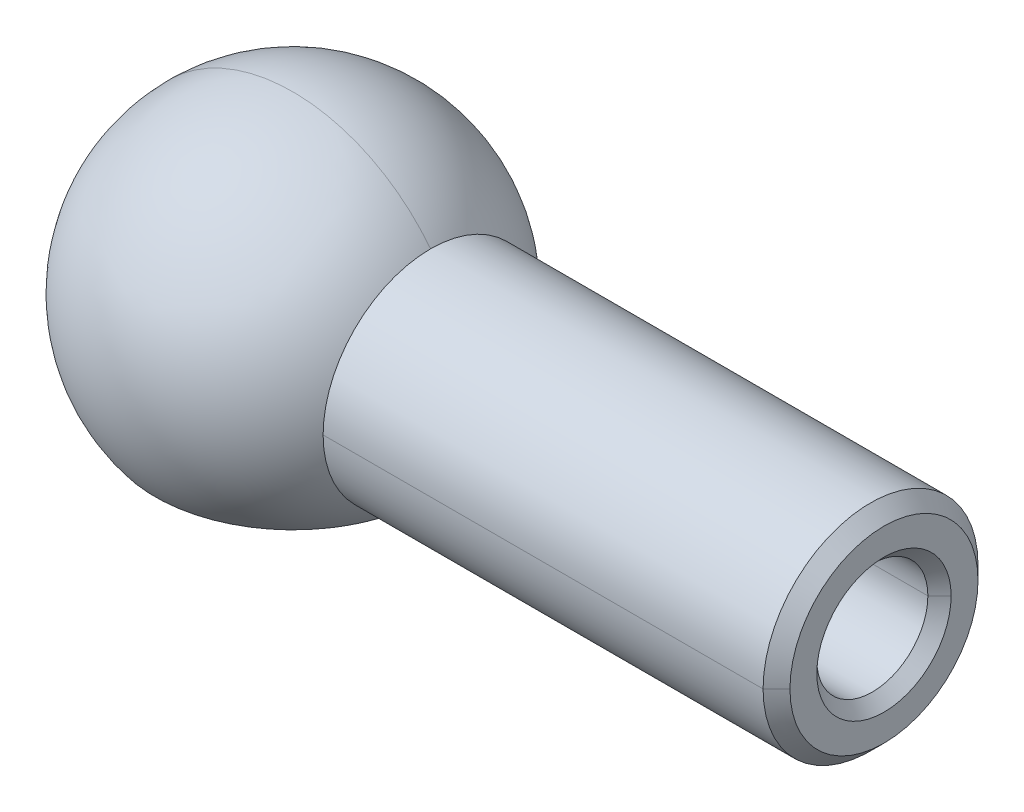
ISO-10303-21;
HEADER;
FILE_DESCRIPTION(('STEP AP214'),'2;1');
FILE_NAME('part.step','',(''),(''),'','','');
FILE_SCHEMA(('AUTOMOTIVE_DESIGN { 1 0 10303 214 1 1 1 1 }'));
ENDSEC;
DATA;
#1=APPLICATION_CONTEXT('core data for automotive mechanical design processes');
#2=APPLICATION_PROTOCOL_DEFINITION('international standard','automotive_design',2000,#1);
#3=PRODUCT_CONTEXT('',#1,'mechanical');
#4=PRODUCT('Part','Part','',(#3));
#5=PRODUCT_RELATED_PRODUCT_CATEGORY('part','',(#4));
#6=PRODUCT_DEFINITION_FORMATION('','',#4);
#7=PRODUCT_DEFINITION_CONTEXT('part definition',#1,'design');
#8=PRODUCT_DEFINITION('design','',#6,#7);
#9=PRODUCT_DEFINITION_SHAPE('','',#8);
#10=(LENGTH_UNIT() NAMED_UNIT(*) SI_UNIT(.MILLI.,.METRE.));
#11=(NAMED_UNIT(*) PLANE_ANGLE_UNIT() SI_UNIT($,.RADIAN.));
#12=(NAMED_UNIT(*) SI_UNIT($,.STERADIAN.) SOLID_ANGLE_UNIT());
#13=UNCERTAINTY_MEASURE_WITH_UNIT(LENGTH_MEASURE(1.E-05),#10,'distance_accuracy_value','');
#14=(GEOMETRIC_REPRESENTATION_CONTEXT(3) GLOBAL_UNCERTAINTY_ASSIGNED_CONTEXT((#13)) GLOBAL_UNIT_ASSIGNED_CONTEXT((#10,
#11,#12)) REPRESENTATION_CONTEXT('',''));
#15=CARTESIAN_POINT('',(0.,0.,0.));
#16=DIRECTION('',(0.,0.,1.));
#17=DIRECTION('',(1.,0.,0.));
#18=AXIS2_PLACEMENT_3D('',#15,#16,#17);
#19=CARTESIAN_POINT('',(-22.,0.,0.));
#20=DIRECTION('',(1.,0.,0.));
#21=DIRECTION('',(0.,0.,1.));
#22=AXIS2_PLACEMENT_3D('',#19,#20,#21);
#23=SPHERICAL_SURFACE('',#22,6.50000000000011);
#24=CARTESIAN_POINT('',(-22.,0.,0.));
#25=DIRECTION('',(0.,0.,1.));
#26=DIRECTION('',(0.788226981996904,0.615384615384601,0.));
#27=AXIS2_PLACEMENT_3D('',#24,#25,#26);
#28=CIRCLE('',#27,6.50000000000011);
#29=CARTESIAN_POINT('',(-16.87652461702,3.9999999999999,0.));
#30=VERTEX_POINT('',#29);
#31=CARTESIAN_POINT('',(-28.5000000000001,0.,0.));
#32=VERTEX_POINT('',#31);
#33=EDGE_CURVE('E11',#30,#32,#28,.T.);
#34=ORIENTED_EDGE('',*,*,#33,.F.);
#35=CARTESIAN_POINT('',(-16.87652461702,0.,0.));
#36=DIRECTION('',(1.,0.,0.));
#37=DIRECTION('',(0.,0.,-1.));
#38=AXIS2_PLACEMENT_3D('',#35,#36,#37);
#39=CIRCLE('',#38,4.);
#40=CARTESIAN_POINT('',(-16.87652461702,0.,-4.));
#41=VERTEX_POINT('',#40);
#42=EDGE_CURVE('E25',#41,#30,#39,.T.);
#43=ORIENTED_EDGE('',*,*,#42,.F.);
#44=CARTESIAN_POINT('',(-16.87652461702,0.,0.));
#45=DIRECTION('',(1.,0.,0.));
#46=DIRECTION('',(0.,0.,-1.));
#47=AXIS2_PLACEMENT_3D('',#44,#45,#46);
#48=CIRCLE('',#47,4.);
#49=CARTESIAN_POINT('',(-16.87652461702,-4.00000000000004,0.));
#50=VERTEX_POINT('',#49);
#51=EDGE_CURVE('E223',#50,#41,#48,.T.);
#52=ORIENTED_EDGE('',*,*,#51,.F.);
#53=CARTESIAN_POINT('',(-22.,0.,0.));
#54=DIRECTION('',(0.,0.,-1.));
#55=DIRECTION('',(0.788226981996904,-0.615384615384601,0.));
#56=AXIS2_PLACEMENT_3D('',#53,#54,#55);
#57=CIRCLE('',#56,6.50000000000011);
#58=CARTESIAN_POINT('',(-16.9000000000001,-4.02988833592232,0.));
#59=VERTEX_POINT('',#58);
#60=EDGE_CURVE('E219',#50,#59,#57,.T.);
#61=ORIENTED_EDGE('',*,*,#60,.T.);
#62=CARTESIAN_POINT('',(-16.9,0.,0.));
#63=DIRECTION('',(-1.,0.,0.));
#64=DIRECTION('',(0.,0.,-1.));
#65=AXIS2_PLACEMENT_3D('',#62,#63,#64);
#66=CIRCLE('',#65,4.0298883359223);
#67=CARTESIAN_POINT('',(-16.9,-4.,-0.489897948559877));
#68=VERTEX_POINT('',#67);
#69=EDGE_CURVE('E214',#68,#59,#66,.T.);
#70=ORIENTED_EDGE('',*,*,#69,.F.);
#71=CARTESIAN_POINT('',(-22.,-4.,0.));
#72=DIRECTION('',(0.,1.,0.));
#73=DIRECTION('',(0.,0.,-1.));
#74=AXIS2_PLACEMENT_3D('',#71,#72,#73);
#75=CIRCLE('',#74,5.12347538298);
#76=CARTESIAN_POINT('',(-27.12347538298,-4.,0.));
#77=VERTEX_POINT('',#76);
#78=EDGE_CURVE('E210',#68,#77,#75,.T.);
#79=ORIENTED_EDGE('',*,*,#78,.T.);
#80=CARTESIAN_POINT('',(-22.,0.,0.));
#81=DIRECTION('',(0.,0.,-1.));
#82=DIRECTION('',(-0.788226981996909,-0.615384615384594,0.));
#83=AXIS2_PLACEMENT_3D('',#80,#81,#82);
#84=CIRCLE('',#83,6.50000000000011);
#85=EDGE_CURVE('E206',#77,#32,#84,.T.);
#86=ORIENTED_EDGE('',*,*,#85,.T.);
#87=EDGE_LOOP('',(#34,#43,#52,#61,#70,#79,#86));
#88=FACE_BOUND('',#87,.T.);
#89=ADVANCED_FACE('F17',(#88),#23,.T.);
#90=CARTESIAN_POINT('',(-22.,0.,0.));
#91=DIRECTION('',(1.,0.,0.));
#92=DIRECTION('',(0.,0.,-1.));
#93=AXIS2_PLACEMENT_3D('',#90,#91,#92);
#94=SPHERICAL_SURFACE('',#93,6.50000000000011);
#95=ORIENTED_EDGE('',*,*,#85,.F.);
#96=CARTESIAN_POINT('',(-22.,-4.,0.));
#97=DIRECTION('',(0.,1.,0.));
#98=DIRECTION('',(0.,0.,-1.));
#99=AXIS2_PLACEMENT_3D('',#96,#97,#98);
#100=CIRCLE('',#99,5.12347538298);
#101=CARTESIAN_POINT('',(-16.9,-4.,0.489897948559877));
#102=VERTEX_POINT('',#101);
#103=EDGE_CURVE('E202',#77,#102,#100,.T.);
#104=ORIENTED_EDGE('',*,*,#103,.T.);
#105=CARTESIAN_POINT('',(-16.9,0.,0.));
#106=DIRECTION('',(-1.,0.,0.));
#107=DIRECTION('',(0.,0.,-1.));
#108=AXIS2_PLACEMENT_3D('',#105,#106,#107);
#109=CIRCLE('',#108,4.0298883359223);
#110=EDGE_CURVE('E197',#59,#102,#109,.T.);
#111=ORIENTED_EDGE('',*,*,#110,.F.);
#112=ORIENTED_EDGE('',*,*,#60,.F.);
#113=CARTESIAN_POINT('',(-16.87652461702,0.,0.));
#114=DIRECTION('',(1.,0.,0.));
#115=DIRECTION('',(0.,0.,-1.));
#116=AXIS2_PLACEMENT_3D('',#113,#114,#115);
#117=CIRCLE('',#116,4.);
#118=CARTESIAN_POINT('',(-16.87652461702,0.,4.));
#119=VERTEX_POINT('',#118);
#120=EDGE_CURVE('E192',#119,#50,#117,.T.);
#121=ORIENTED_EDGE('',*,*,#120,.F.);
#122=CARTESIAN_POINT('',(-16.87652461702,0.,0.));
#123=DIRECTION('',(1.,0.,0.));
#124=DIRECTION('',(0.,0.,-1.));
#125=AXIS2_PLACEMENT_3D('',#122,#123,#124);
#126=CIRCLE('',#125,4.);
#127=EDGE_CURVE('E187',#30,#119,#126,.T.);
#128=ORIENTED_EDGE('',*,*,#127,.F.);
#129=ORIENTED_EDGE('',*,*,#33,.T.);
#130=EDGE_LOOP('',(#95,#104,#111,#112,#121,#128,#129));
#131=FACE_BOUND('',#130,.T.);
#132=ADVANCED_FACE('F237',(#131),#94,.T.);
#133=CARTESIAN_POINT('',(0.,0.,0.));
#134=DIRECTION('',(1.,0.,0.));
#135=DIRECTION('',(0.,-1.,0.));
#136=AXIS2_PLACEMENT_3D('',#133,#134,#135);
#137=CYLINDRICAL_SURFACE('',#136,4.);
#138=DIRECTION('',(1.,0.,0.));
#139=VECTOR('',#138,1.);
#140=CARTESIAN_POINT('',(-16.87652461702,0.,4.));
#141=LINE('',#140,#139);
#142=CARTESIAN_POINT('',(-0.5,0.,4.));
#143=VERTEX_POINT('',#142);
#144=EDGE_CURVE('E183',#119,#143,#141,.T.);
#145=ORIENTED_EDGE('',*,*,#144,.T.);
#146=CARTESIAN_POINT('',(-0.5,0.,0.));
#147=DIRECTION('',(1.,0.,0.));
#148=DIRECTION('',(0.,0.,-1.));
#149=AXIS2_PLACEMENT_3D('',#146,#147,#148);
#150=CIRCLE('',#149,4.);
#151=CARTESIAN_POINT('',(-0.5,0.,-4.));
#152=VERTEX_POINT('',#151);
#153=EDGE_CURVE('E178',#152,#143,#150,.T.);
#154=ORIENTED_EDGE('',*,*,#153,.F.);
#155=DIRECTION('',(1.,0.,0.));
#156=VECTOR('',#155,1.);
#157=CARTESIAN_POINT('',(-16.87652461702,0.,-4.));
#158=LINE('',#157,#156);
#159=EDGE_CURVE('E173',#41,#152,#158,.T.);
#160=ORIENTED_EDGE('',*,*,#159,.F.);
#161=ORIENTED_EDGE('',*,*,#42,.T.);
#162=ORIENTED_EDGE('',*,*,#127,.T.);
#163=EDGE_LOOP('',(#145,#154,#160,#161,#162));
#164=FACE_BOUND('',#163,.T.);
#165=ADVANCED_FACE('F234',(#164),#137,.T.);
#166=CARTESIAN_POINT('',(0.,0.,0.));
#167=DIRECTION('',(1.,0.,0.));
#168=DIRECTION('',(0.,1.,-5.8935951136395E-10));
#169=AXIS2_PLACEMENT_3D('',#166,#167,#168);
#170=CYLINDRICAL_SURFACE('',#169,4.);
#171=ORIENTED_EDGE('',*,*,#144,.F.);
#172=ORIENTED_EDGE('',*,*,#120,.T.);
#173=ORIENTED_EDGE('',*,*,#51,.T.);
#174=ORIENTED_EDGE('',*,*,#159,.T.);
#175=CARTESIAN_POINT('',(-0.5,0.,0.));
#176=DIRECTION('',(1.,0.,0.));
#177=DIRECTION('',(0.,0.,-1.));
#178=AXIS2_PLACEMENT_3D('',#175,#176,#177);
#179=CIRCLE('',#178,4.);
#180=EDGE_CURVE('E168',#143,#152,#179,.T.);
#181=ORIENTED_EDGE('',*,*,#180,.F.);
#182=EDGE_LOOP('',(#171,#172,#173,#174,#181));
#183=FACE_BOUND('',#182,.T.);
#184=ADVANCED_FACE('F243',(#183),#170,.T.);
#185=CARTESIAN_POINT('',(-0.5,0.,0.));
#186=DIRECTION('',(-1.,0.,0.));
#187=DIRECTION('',(0.,1.,0.));
#188=AXIS2_PLACEMENT_3D('',#185,#186,#187);
#189=CONICAL_SURFACE('',#188,4.,0.785398163397448);
#190=DIRECTION('',(-0.707106781186548,0.,-0.707106781186547));
#191=VECTOR('',#190,1.);
#192=CARTESIAN_POINT('',(0.,0.,-3.5));
#193=LINE('',#192,#191);
#194=CARTESIAN_POINT('',(0.,0.,-3.5));
#195=VERTEX_POINT('',#194);
#196=EDGE_CURVE('E163',#195,#152,#193,.T.);
#197=ORIENTED_EDGE('',*,*,#196,.F.);
#198=CARTESIAN_POINT('',(0.,0.,0.));
#199=DIRECTION('',(1.,0.,0.));
#200=DIRECTION('',(0.,0.,-1.));
#201=AXIS2_PLACEMENT_3D('',#198,#199,#200);
#202=CIRCLE('',#201,3.5);
#203=CARTESIAN_POINT('',(0.,0.,3.5));
#204=VERTEX_POINT('',#203);
#205=EDGE_CURVE('E158',#204,#195,#202,.T.);
#206=ORIENTED_EDGE('',*,*,#205,.F.);
#207=DIRECTION('',(-0.707106781186548,0.,0.707106781186547));
#208=VECTOR('',#207,1.);
#209=CARTESIAN_POINT('',(0.,0.,3.5));
#210=LINE('',#209,#208);
#211=EDGE_CURVE('E153',#204,#143,#210,.T.);
#212=ORIENTED_EDGE('',*,*,#211,.T.);
#213=ORIENTED_EDGE('',*,*,#180,.T.);
#214=EDGE_LOOP('',(#197,#206,#212,#213));
#215=FACE_BOUND('',#214,.T.);
#216=ADVANCED_FACE('F247',(#215),#189,.T.);
#217=CARTESIAN_POINT('',(-0.5,0.,0.));
#218=DIRECTION('',(-1.,0.,0.));
#219=DIRECTION('',(0.,-1.,0.));
#220=AXIS2_PLACEMENT_3D('',#217,#218,#219);
#221=CONICAL_SURFACE('',#220,4.,0.785398163397448);
#222=ORIENTED_EDGE('',*,*,#196,.T.);
#223=ORIENTED_EDGE('',*,*,#153,.T.);
#224=ORIENTED_EDGE('',*,*,#211,.F.);
#225=CARTESIAN_POINT('',(0.,0.,0.));
#226=DIRECTION('',(1.,0.,0.));
#227=DIRECTION('',(0.,0.,-1.));
#228=AXIS2_PLACEMENT_3D('',#225,#226,#227);
#229=CIRCLE('',#228,3.5);
#230=EDGE_CURVE('E148',#195,#204,#229,.T.);
#231=ORIENTED_EDGE('',*,*,#230,.F.);
#232=EDGE_LOOP('',(#222,#223,#224,#231));
#233=FACE_BOUND('',#232,.T.);
#234=ADVANCED_FACE('F249',(#233),#221,.T.);
#235=CARTESIAN_POINT('',(0.,3.5,0.));
#236=DIRECTION('',(-1.,0.,0.));
#237=DIRECTION('',(0.,0.,1.));
#238=AXIS2_PLACEMENT_3D('',#235,#236,#237);
#239=PLANE('',#238);
#240=CARTESIAN_POINT('',(0.,0.,0.));
#241=DIRECTION('',(1.,0.,0.));
#242=DIRECTION('',(0.,0.,-1.));
#243=AXIS2_PLACEMENT_3D('',#240,#241,#242);
#244=CIRCLE('',#243,2.5);
#245=CARTESIAN_POINT('',(0.,0.,2.5));
#246=VERTEX_POINT('',#245);
#247=CARTESIAN_POINT('',(0.,0.,-2.5));
#248=VERTEX_POINT('',#247);
#249=EDGE_CURVE('E143',#246,#248,#244,.T.);
#250=ORIENTED_EDGE('',*,*,#249,.F.);
#251=CARTESIAN_POINT('',(0.,0.,0.));
#252=DIRECTION('',(1.,0.,0.));
#253=DIRECTION('',(0.,0.,-1.));
#254=AXIS2_PLACEMENT_3D('',#251,#252,#253);
#255=CIRCLE('',#254,2.5);
#256=EDGE_CURVE('E138',#248,#246,#255,.T.);
#257=ORIENTED_EDGE('',*,*,#256,.F.);
#258=EDGE_LOOP('',(#250,#257));
#259=FACE_BOUND('',#258,.T.);
#260=ORIENTED_EDGE('',*,*,#230,.T.);
#261=ORIENTED_EDGE('',*,*,#205,.T.);
#262=EDGE_LOOP('',(#260,#261));
#263=FACE_BOUND('',#262,.T.);
#264=ADVANCED_FACE('F251',(#259,#263),#239,.F.);
#265=CARTESIAN_POINT('',(-0.433,0.,0.));
#266=DIRECTION('',(1.,0.,0.));
#267=DIRECTION('',(0.,-1.,0.));
#268=AXIS2_PLACEMENT_3D('',#265,#266,#267);
#269=CONICAL_SURFACE('',#268,2.067,0.785398163397449);
#270=DIRECTION('',(0.707106781186547,0.,0.707106781186548));
#271=VECTOR('',#270,1.);
#272=CARTESIAN_POINT('',(-0.433,0.,2.067));
#273=LINE('',#272,#271);
#274=CARTESIAN_POINT('',(-0.433,0.,2.067));
#275=VERTEX_POINT('',#274);
#276=EDGE_CURVE('E133',#275,#246,#273,.T.);
#277=ORIENTED_EDGE('',*,*,#276,.F.);
#278=CARTESIAN_POINT('',(-0.433,0.,0.));
#279=DIRECTION('',(1.,0.,0.));
#280=DIRECTION('',(0.,0.,-1.));
#281=AXIS2_PLACEMENT_3D('',#278,#279,#280);
#282=CIRCLE('',#281,2.067);
#283=CARTESIAN_POINT('',(-0.433,0.,-2.067));
#284=VERTEX_POINT('',#283);
#285=EDGE_CURVE('E128',#284,#275,#282,.T.);
#286=ORIENTED_EDGE('',*,*,#285,.F.);
#287=DIRECTION('',(0.707106781186547,0.,-0.707106781186548));
#288=VECTOR('',#287,1.);
#289=CARTESIAN_POINT('',(-0.433,0.,-2.067));
#290=LINE('',#289,#288);
#291=EDGE_CURVE('E123',#284,#248,#290,.T.);
#292=ORIENTED_EDGE('',*,*,#291,.T.);
#293=ORIENTED_EDGE('',*,*,#256,.T.);
#294=EDGE_LOOP('',(#277,#286,#292,#293));
#295=FACE_BOUND('',#294,.T.);
#296=ADVANCED_FACE('F253',(#295),#269,.F.);
#297=CARTESIAN_POINT('',(-0.433,0.,0.));
#298=DIRECTION('',(1.,0.,0.));
#299=DIRECTION('',(0.,1.,0.));
#300=AXIS2_PLACEMENT_3D('',#297,#298,#299);
#301=CONICAL_SURFACE('',#300,2.067,0.785398163397449);
#302=ORIENTED_EDGE('',*,*,#276,.T.);
#303=ORIENTED_EDGE('',*,*,#249,.T.);
#304=ORIENTED_EDGE('',*,*,#291,.F.);
#305=CARTESIAN_POINT('',(-0.433,0.,0.));
#306=DIRECTION('',(1.,0.,0.));
#307=DIRECTION('',(0.,0.,-1.));
#308=AXIS2_PLACEMENT_3D('',#305,#306,#307);
#309=CIRCLE('',#308,2.067);
#310=EDGE_CURVE('E118',#275,#284,#309,.T.);
#311=ORIENTED_EDGE('',*,*,#310,.F.);
#312=EDGE_LOOP('',(#302,#303,#304,#311));
#313=FACE_BOUND('',#312,.T.);
#314=ADVANCED_FACE('F261',(#313),#301,.F.);
#315=CARTESIAN_POINT('',(0.,0.,0.));
#316=DIRECTION('',(1.,0.,0.));
#317=DIRECTION('',(0.,1.,0.));
#318=AXIS2_PLACEMENT_3D('',#315,#316,#317);
#319=CYLINDRICAL_SURFACE('',#318,2.067);
#320=DIRECTION('',(1.,0.,0.));
#321=VECTOR('',#320,1.);
#322=CARTESIAN_POINT('',(-13.933,0.,2.067));
#323=LINE('',#322,#321);
#324=CARTESIAN_POINT('',(-13.933,0.,2.067));
#325=VERTEX_POINT('',#324);
#326=EDGE_CURVE('E113',#325,#275,#323,.T.);
#327=ORIENTED_EDGE('',*,*,#326,.T.);
#328=ORIENTED_EDGE('',*,*,#310,.T.);
#329=DIRECTION('',(1.,0.,0.));
#330=VECTOR('',#329,1.);
#331=CARTESIAN_POINT('',(-13.933,0.,-2.067));
#332=LINE('',#331,#330);
#333=CARTESIAN_POINT('',(-13.933,0.,-2.067));
#334=VERTEX_POINT('',#333);
#335=EDGE_CURVE('E102',#334,#284,#332,.T.);
#336=ORIENTED_EDGE('',*,*,#335,.F.);
#337=CARTESIAN_POINT('',(-13.933,0.,0.));
#338=DIRECTION('',(1.,0.,0.));
#339=DIRECTION('',(0.,0.,-1.));
#340=AXIS2_PLACEMENT_3D('',#337,#338,#339);
#341=CIRCLE('',#340,2.067);
#342=EDGE_CURVE('E94',#325,#334,#341,.T.);
#343=ORIENTED_EDGE('',*,*,#342,.F.);
#344=EDGE_LOOP('',(#327,#328,#336,#343));
#345=FACE_BOUND('',#344,.T.);
#346=ADVANCED_FACE('F312',(#345),#319,.F.);
#347=CARTESIAN_POINT('',(-16.,0.,0.));
#348=DIRECTION('',(1.,0.,0.));
#349=DIRECTION('',(0.,1.,0.));
#350=AXIS2_PLACEMENT_3D('',#347,#348,#349);
#351=CONICAL_SURFACE('',#350,0.,0.785398163397449);
#352=DIRECTION('',(0.707106781186547,0.,0.707106781186548));
#353=VECTOR('',#352,1.);
#354=CARTESIAN_POINT('',(-16.,0.,0.));
#355=LINE('',#354,#353);
#356=CARTESIAN_POINT('',(-16.,0.,0.));
#357=VERTEX_POINT('',#356);
#358=EDGE_CURVE('E93',#357,#325,#355,.T.);
#359=ORIENTED_EDGE('',*,*,#358,.T.);
#360=ORIENTED_EDGE('',*,*,#342,.T.);
#361=DIRECTION('',(0.707106781186547,0.,-0.707106781186548));
#362=VECTOR('',#361,1.);
#363=CARTESIAN_POINT('',(-16.,0.,0.));
#364=LINE('',#363,#362);
#365=EDGE_CURVE('E90',#357,#334,#364,.T.);
#366=ORIENTED_EDGE('',*,*,#365,.F.);
#367=EDGE_LOOP('',(#359,#360,#366));
#368=FACE_BOUND('',#367,.T.);
#369=ADVANCED_FACE('F92',(#368),#351,.F.);
#370=CARTESIAN_POINT('',(-16.,0.,0.));
#371=DIRECTION('',(1.,0.,0.));
#372=DIRECTION('',(0.,-1.,0.));
#373=AXIS2_PLACEMENT_3D('',#370,#371,#372);
#374=CONICAL_SURFACE('',#373,0.,0.785398163397449);
#375=ORIENTED_EDGE('',*,*,#365,.T.);
#376=CARTESIAN_POINT('',(-13.933,0.,0.));
#377=DIRECTION('',(1.,0.,0.));
#378=DIRECTION('',(0.,0.,-1.));
#379=AXIS2_PLACEMENT_3D('',#376,#377,#378);
#380=CIRCLE('',#379,2.067);
#381=EDGE_CURVE('E97',#334,#325,#380,.T.);
#382=ORIENTED_EDGE('',*,*,#381,.T.);
#383=ORIENTED_EDGE('',*,*,#358,.F.);
#384=EDGE_LOOP('',(#375,#382,#383));
#385=FACE_BOUND('',#384,.T.);
#386=ADVANCED_FACE('F99',(#385),#374,.F.);
#387=CARTESIAN_POINT('',(0.,0.,0.));
#388=DIRECTION('',(1.,0.,0.));
#389=DIRECTION('',(0.,-1.,0.));
#390=AXIS2_PLACEMENT_3D('',#387,#388,#389);
#391=CYLINDRICAL_SURFACE('',#390,2.067);
#392=ORIENTED_EDGE('',*,*,#326,.F.);
#393=ORIENTED_EDGE('',*,*,#381,.F.);
#394=ORIENTED_EDGE('',*,*,#335,.T.);
#395=ORIENTED_EDGE('',*,*,#285,.T.);
#396=EDGE_LOOP('',(#392,#393,#394,#395));
#397=FACE_BOUND('',#396,.T.);
#398=ADVANCED_FACE('F342',(#397),#391,.F.);
#399=CARTESIAN_POINT('',(-16.9,0.,0.));
#400=DIRECTION('',(1.,0.,0.));
#401=DIRECTION('',(0.,0.,-1.));
#402=AXIS2_PLACEMENT_3D('',#399,#400,#401);
#403=PLANE('',#402);
#404=ORIENTED_EDGE('',*,*,#69,.T.);
#405=ORIENTED_EDGE('',*,*,#110,.T.);
#406=DIRECTION('',(0.,0.,-1.));
#407=VECTOR('',#406,1.);
#408=CARTESIAN_POINT('',(-16.9,-4.,10.));
#409=LINE('',#408,#407);
#410=EDGE_CURVE('E427',#102,#68,#409,.T.);
#411=ORIENTED_EDGE('',*,*,#410,.T.);
#412=EDGE_LOOP('',(#404,#405,#411));
#413=FACE_BOUND('',#412,.T.);
#414=ADVANCED_FACE('F352',(#413),#403,.F.);
#415=CARTESIAN_POINT('',(-46.9,-4.,10.));
#416=DIRECTION('',(0.,-1.,0.));
#417=DIRECTION('',(0.,0.,-1.));
#418=AXIS2_PLACEMENT_3D('',#415,#416,#417);
#419=PLANE('',#418);
#420=ORIENTED_EDGE('',*,*,#410,.F.);
#421=ORIENTED_EDGE('',*,*,#103,.F.);
#422=ORIENTED_EDGE('',*,*,#78,.F.);
#423=EDGE_LOOP('',(#420,#421,#422));
#424=FACE_BOUND('',#423,.T.);
#425=ADVANCED_FACE('F363',(#424),#419,.T.);
#426=CLOSED_SHELL('',(#89,#132,#165,#184,#216,#234,#264,#296,#314,#346,#369,#386,#398,#414,#425));
#427=MANIFOLD_SOLID_BREP('B1',#426);
#428=ADVANCED_BREP_SHAPE_REPRESENTATION('',(#18,#427),#14);
#429=SHAPE_DEFINITION_REPRESENTATION(#9,#428);
ENDSEC;
END-ISO-10303-21;
